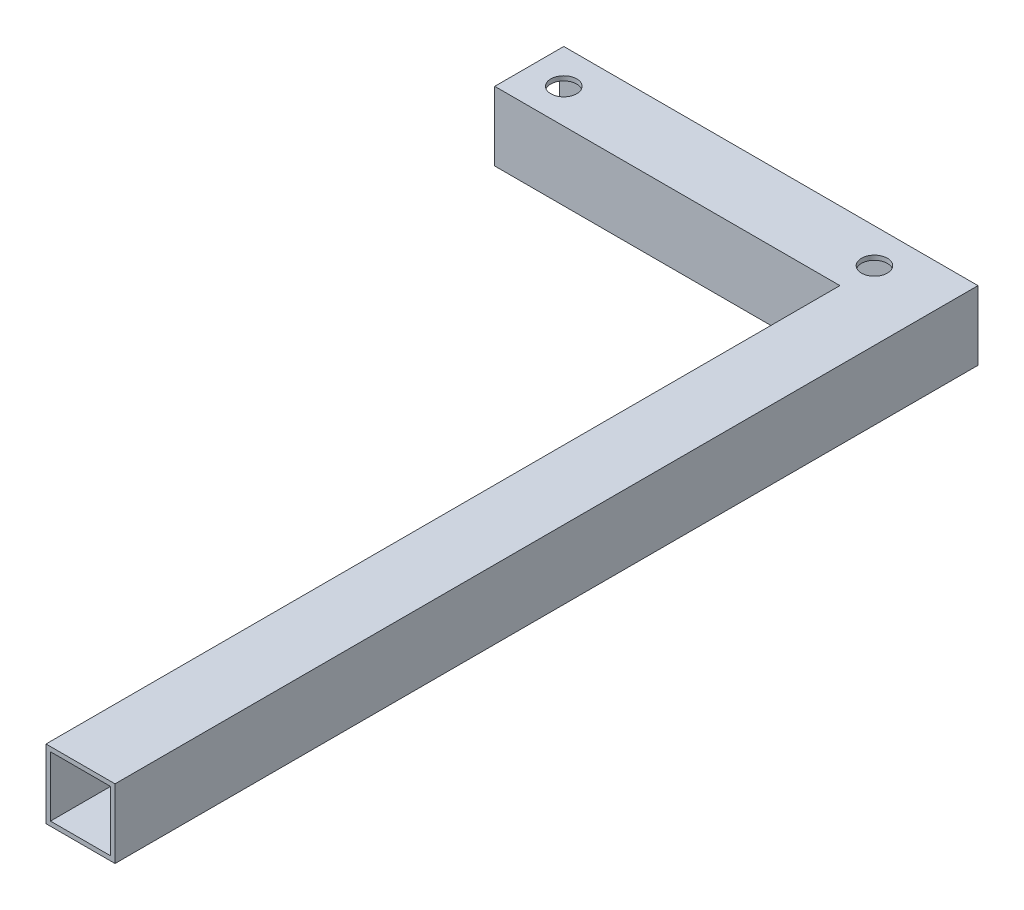
ISO-10303-21;
HEADER;
FILE_DESCRIPTION(('STEP AP214'),'2;1');
FILE_NAME('part.step','',(''),(''),'','','');
FILE_SCHEMA(('AUTOMOTIVE_DESIGN { 1 0 10303 214 1 1 1 1 }'));
ENDSEC;
DATA;
#1=APPLICATION_CONTEXT('core data for automotive mechanical design processes');
#2=APPLICATION_PROTOCOL_DEFINITION('international standard','automotive_design',2000,#1);
#3=PRODUCT_CONTEXT('',#1,'mechanical');
#4=PRODUCT('Part','Part','',(#3));
#5=PRODUCT_RELATED_PRODUCT_CATEGORY('part','',(#4));
#6=PRODUCT_DEFINITION_FORMATION('','',#4);
#7=PRODUCT_DEFINITION_CONTEXT('part definition',#1,'design');
#8=PRODUCT_DEFINITION('design','',#6,#7);
#9=PRODUCT_DEFINITION_SHAPE('','',#8);
#10=(LENGTH_UNIT() NAMED_UNIT(*) SI_UNIT(.MILLI.,.METRE.));
#11=(NAMED_UNIT(*) PLANE_ANGLE_UNIT() SI_UNIT($,.RADIAN.));
#12=(NAMED_UNIT(*) SI_UNIT($,.STERADIAN.) SOLID_ANGLE_UNIT());
#13=UNCERTAINTY_MEASURE_WITH_UNIT(LENGTH_MEASURE(1.E-05),#10,'distance_accuracy_value','');
#14=(GEOMETRIC_REPRESENTATION_CONTEXT(3) GLOBAL_UNCERTAINTY_ASSIGNED_CONTEXT((#13)) GLOBAL_UNIT_ASSIGNED_CONTEXT((#10,
#11,#12)) REPRESENTATION_CONTEXT('',''));
#15=CARTESIAN_POINT('',(0.,0.,0.));
#16=DIRECTION('',(0.,0.,1.));
#17=DIRECTION('',(1.,0.,0.));
#18=AXIS2_PLACEMENT_3D('',#15,#16,#17);
#19=CARTESIAN_POINT('',(-12.7,12.7,-12.7));
#20=DIRECTION('',(1.,0.,0.));
#21=DIRECTION('',(0.,0.,-1.));
#22=AXIS2_PLACEMENT_3D('',#19,#20,#21);
#23=PLANE('',#22);
#24=DIRECTION('',(0.,0.,1.));
#25=VECTOR('',#24,1.);
#26=CARTESIAN_POINT('',(-12.7,-12.7,-12.7));
#27=LINE('',#26,#25);
#28=CARTESIAN_POINT('',(-12.7,-12.7,-12.7));
#29=VERTEX_POINT('',#28);
#30=CARTESIAN_POINT('',(-12.7,-12.7,12.7));
#31=VERTEX_POINT('',#30);
#32=EDGE_CURVE('E194',#29,#31,#27,.T.);
#33=ORIENTED_EDGE('',*,*,#32,.T.);
#34=DIRECTION('',(0.,-1.,0.));
#35=VECTOR('',#34,1.);
#36=CARTESIAN_POINT('',(-12.7,12.7,12.7));
#37=LINE('',#36,#35);
#38=CARTESIAN_POINT('',(-12.7,12.7,12.7));
#39=VERTEX_POINT('',#38);
#40=EDGE_CURVE('E11',#39,#31,#37,.T.);
#41=ORIENTED_EDGE('',*,*,#40,.F.);
#42=DIRECTION('',(0.,0.,1.));
#43=VECTOR('',#42,1.);
#44=CARTESIAN_POINT('',(-12.7,12.7,-12.7));
#45=LINE('',#44,#43);
#46=CARTESIAN_POINT('',(-12.7,12.7,-12.7));
#47=VERTEX_POINT('',#46);
#48=EDGE_CURVE('E197',#47,#39,#45,.T.);
#49=ORIENTED_EDGE('',*,*,#48,.F.);
#50=DIRECTION('',(0.,-1.,0.));
#51=VECTOR('',#50,1.);
#52=CARTESIAN_POINT('',(-12.7,12.7,-12.7));
#53=LINE('',#52,#51);
#54=EDGE_CURVE('E211',#47,#29,#53,.T.);
#55=ORIENTED_EDGE('',*,*,#54,.T.);
#56=EDGE_LOOP('',(#33,#41,#49,#55));
#57=FACE_BOUND('',#56,.T.);
#58=DIRECTION('',(0.,0.,1.));
#59=VECTOR('',#58,1.);
#60=CARTESIAN_POINT('',(-12.7,-11.049,-12.7));
#61=LINE('',#60,#59);
#62=CARTESIAN_POINT('',(-12.7,-11.049,-11.049));
#63=VERTEX_POINT('',#62);
#64=CARTESIAN_POINT('',(-12.7,-11.049,11.049));
#65=VERTEX_POINT('',#64);
#66=EDGE_CURVE('E150',#63,#65,#61,.T.);
#67=ORIENTED_EDGE('',*,*,#66,.F.);
#68=DIRECTION('',(0.,-1.,0.));
#69=VECTOR('',#68,1.);
#70=CARTESIAN_POINT('',(-12.7,12.7,-11.049));
#71=LINE('',#70,#69);
#72=CARTESIAN_POINT('',(-12.7,11.049,-11.049));
#73=VERTEX_POINT('',#72);
#74=EDGE_CURVE('E148',#73,#63,#71,.T.);
#75=ORIENTED_EDGE('',*,*,#74,.F.);
#76=DIRECTION('',(0.,0.,1.));
#77=VECTOR('',#76,1.);
#78=CARTESIAN_POINT('',(-12.7,11.049,-12.7));
#79=LINE('',#78,#77);
#80=CARTESIAN_POINT('',(-12.7,11.049,11.049));
#81=VERTEX_POINT('',#80);
#82=EDGE_CURVE('E47',#73,#81,#79,.T.);
#83=ORIENTED_EDGE('',*,*,#82,.T.);
#84=DIRECTION('',(0.,-1.,0.));
#85=VECTOR('',#84,1.);
#86=CARTESIAN_POINT('',(-12.7,12.7,11.049));
#87=LINE('',#86,#85);
#88=EDGE_CURVE('E129',#81,#65,#87,.T.);
#89=ORIENTED_EDGE('',*,*,#88,.T.);
#90=EDGE_LOOP('',(#67,#75,#83,#89));
#91=FACE_BOUND('',#90,.T.);
#92=ADVANCED_FACE('F33',(#57,#91),#23,.F.);
#93=CARTESIAN_POINT('',(139.7,12.7,304.8));
#94=DIRECTION('',(0.,0.,-1.));
#95=DIRECTION('',(-1.,0.,0.));
#96=AXIS2_PLACEMENT_3D('',#93,#94,#95);
#97=PLANE('',#96);
#98=DIRECTION('',(1.,0.,0.));
#99=VECTOR('',#98,1.);
#100=CARTESIAN_POINT('',(139.7,-12.7,304.8));
#101=LINE('',#100,#99);
#102=CARTESIAN_POINT('',(114.3,-12.7,304.8));
#103=VERTEX_POINT('',#102);
#104=CARTESIAN_POINT('',(139.7,-12.7,304.8));
#105=VERTEX_POINT('',#104);
#106=EDGE_CURVE('E218',#103,#105,#101,.T.);
#107=ORIENTED_EDGE('',*,*,#106,.T.);
#108=DIRECTION('',(0.,-1.,0.));
#109=VECTOR('',#108,1.);
#110=CARTESIAN_POINT('',(139.7,12.7,304.8));
#111=LINE('',#110,#109);
#112=CARTESIAN_POINT('',(139.7,12.7,304.8));
#113=VERTEX_POINT('',#112);
#114=EDGE_CURVE('E228',#113,#105,#111,.T.);
#115=ORIENTED_EDGE('',*,*,#114,.F.);
#116=DIRECTION('',(1.,0.,0.));
#117=VECTOR('',#116,1.);
#118=CARTESIAN_POINT('',(139.7,12.7,304.8));
#119=LINE('',#118,#117);
#120=CARTESIAN_POINT('',(114.3,12.7,304.8));
#121=VERTEX_POINT('',#120);
#122=EDGE_CURVE('E205',#121,#113,#119,.T.);
#123=ORIENTED_EDGE('',*,*,#122,.F.);
#124=DIRECTION('',(0.,-1.,0.));
#125=VECTOR('',#124,1.);
#126=CARTESIAN_POINT('',(114.3,12.7,304.8));
#127=LINE('',#126,#125);
#128=EDGE_CURVE('E231',#121,#103,#127,.T.);
#129=ORIENTED_EDGE('',*,*,#128,.T.);
#130=EDGE_LOOP('',(#107,#115,#123,#129));
#131=FACE_BOUND('',#130,.T.);
#132=DIRECTION('',(1.,0.,0.));
#133=VECTOR('',#132,1.);
#134=CARTESIAN_POINT('',(139.7,-11.049,304.8));
#135=LINE('',#134,#133);
#136=CARTESIAN_POINT('',(115.951,-11.049,304.8));
#137=VERTEX_POINT('',#136);
#138=CARTESIAN_POINT('',(138.049,-11.049,304.8));
#139=VERTEX_POINT('',#138);
#140=EDGE_CURVE('E156',#137,#139,#135,.T.);
#141=ORIENTED_EDGE('',*,*,#140,.F.);
#142=DIRECTION('',(0.,-1.,0.));
#143=VECTOR('',#142,1.);
#144=CARTESIAN_POINT('',(115.951,12.7,304.8));
#145=LINE('',#144,#143);
#146=CARTESIAN_POINT('',(115.951,11.049,304.8));
#147=VERTEX_POINT('',#146);
#148=EDGE_CURVE('E137',#147,#137,#145,.T.);
#149=ORIENTED_EDGE('',*,*,#148,.F.);
#150=DIRECTION('',(1.,0.,0.));
#151=VECTOR('',#150,1.);
#152=CARTESIAN_POINT('',(139.7,11.049,304.8));
#153=LINE('',#152,#151);
#154=CARTESIAN_POINT('',(138.049,11.049,304.8));
#155=VERTEX_POINT('',#154);
#156=EDGE_CURVE('E54',#147,#155,#153,.T.);
#157=ORIENTED_EDGE('',*,*,#156,.T.);
#158=DIRECTION('',(0.,-1.,0.));
#159=VECTOR('',#158,1.);
#160=CARTESIAN_POINT('',(138.049,12.7,304.8));
#161=LINE('',#160,#159);
#162=EDGE_CURVE('E161',#155,#139,#161,.T.);
#163=ORIENTED_EDGE('',*,*,#162,.T.);
#164=EDGE_LOOP('',(#141,#149,#157,#163));
#165=FACE_BOUND('',#164,.T.);
#166=ADVANCED_FACE('F250',(#131,#165),#97,.F.);
#167=CARTESIAN_POINT('',(0.,12.7,0.));
#168=DIRECTION('',(0.,-1.,0.));
#169=DIRECTION('',(0.,0.,-1.));
#170=AXIS2_PLACEMENT_3D('',#167,#168,#169);
#171=CYLINDRICAL_SURFACE('',#170,4.7625);
#172=CARTESIAN_POINT('',(0.,-12.7,0.));
#173=DIRECTION('',(0.,1.,0.));
#174=DIRECTION('',(0.,0.,1.));
#175=AXIS2_PLACEMENT_3D('',#172,#173,#174);
#176=CIRCLE('',#175,4.7625);
#177=CARTESIAN_POINT('',(0.,-12.7,4.7625));
#178=VERTEX_POINT('',#177);
#179=EDGE_CURVE('E188',#178,#178,#176,.T.);
#180=ORIENTED_EDGE('',*,*,#179,.F.);
#181=EDGE_LOOP('',(#180));
#182=FACE_BOUND('',#181,.T.);
#183=CARTESIAN_POINT('',(0.,-11.049,0.));
#184=DIRECTION('',(0.,1.,0.));
#185=DIRECTION('',(0.,0.,1.));
#186=AXIS2_PLACEMENT_3D('',#183,#184,#185);
#187=CIRCLE('',#186,4.7625);
#188=CARTESIAN_POINT('',(0.,-11.049,4.7625));
#189=VERTEX_POINT('',#188);
#190=EDGE_CURVE('E165',#189,#189,#187,.T.);
#191=ORIENTED_EDGE('',*,*,#190,.T.);
#192=EDGE_LOOP('',(#191));
#193=FACE_BOUND('',#192,.T.);
#194=ADVANCED_FACE('F279',(#182,#193),#171,.F.);
#195=CARTESIAN_POINT('',(114.3,12.7,0.));
#196=DIRECTION('',(0.,-1.,0.));
#197=DIRECTION('',(0.,0.,-1.));
#198=AXIS2_PLACEMENT_3D('',#195,#196,#197);
#199=CYLINDRICAL_SURFACE('',#198,4.76250000000001);
#200=CARTESIAN_POINT('',(114.3,-12.7,0.));
#201=DIRECTION('',(0.,1.,0.));
#202=DIRECTION('',(0.,0.,1.));
#203=AXIS2_PLACEMENT_3D('',#200,#201,#202);
#204=CIRCLE('',#203,4.76250000000001);
#205=CARTESIAN_POINT('',(114.3,-12.7,4.76250000000001));
#206=VERTEX_POINT('',#205);
#207=EDGE_CURVE('E171',#206,#206,#204,.T.);
#208=ORIENTED_EDGE('',*,*,#207,.F.);
#209=EDGE_LOOP('',(#208));
#210=FACE_BOUND('',#209,.T.);
#211=CARTESIAN_POINT('',(114.3,-11.049,0.));
#212=DIRECTION('',(0.,1.,0.));
#213=DIRECTION('',(0.,0.,1.));
#214=AXIS2_PLACEMENT_3D('',#211,#212,#213);
#215=CIRCLE('',#214,4.76250000000001);
#216=CARTESIAN_POINT('',(114.3,-11.049,4.76250000000001));
#217=VERTEX_POINT('',#216);
#218=EDGE_CURVE('E180',#217,#217,#215,.T.);
#219=ORIENTED_EDGE('',*,*,#218,.T.);
#220=EDGE_LOOP('',(#219));
#221=FACE_BOUND('',#220,.T.);
#222=ADVANCED_FACE('F290',(#210,#221),#199,.F.);
#223=CARTESIAN_POINT('',(0.,12.7,0.));
#224=DIRECTION('',(0.,1.,0.));
#225=DIRECTION('',(0.,0.,1.));
#226=AXIS2_PLACEMENT_3D('',#223,#224,#225);
#227=PLANE('',#226);
#228=CARTESIAN_POINT('',(0.,12.7,0.));
#229=DIRECTION('',(0.,1.,0.));
#230=DIRECTION('',(0.,0.,1.));
#231=AXIS2_PLACEMENT_3D('',#228,#229,#230);
#232=CIRCLE('',#231,4.7625);
#233=CARTESIAN_POINT('',(0.,12.7,4.7625));
#234=VERTEX_POINT('',#233);
#235=EDGE_CURVE('E191',#234,#234,#232,.T.);
#236=ORIENTED_EDGE('',*,*,#235,.F.);
#237=EDGE_LOOP('',(#236));
#238=FACE_BOUND('',#237,.T.);
#239=ORIENTED_EDGE('',*,*,#48,.T.);
#240=DIRECTION('',(1.,0.,0.));
#241=VECTOR('',#240,1.);
#242=CARTESIAN_POINT('',(-12.7,12.7,12.7));
#243=LINE('',#242,#241);
#244=CARTESIAN_POINT('',(114.3,12.7,12.7));
#245=VERTEX_POINT('',#244);
#246=EDGE_CURVE('E200',#39,#245,#243,.T.);
#247=ORIENTED_EDGE('',*,*,#246,.T.);
#248=DIRECTION('',(0.,0.,1.));
#249=VECTOR('',#248,1.);
#250=CARTESIAN_POINT('',(114.3,12.7,12.7));
#251=LINE('',#250,#249);
#252=EDGE_CURVE('E203',#245,#121,#251,.T.);
#253=ORIENTED_EDGE('',*,*,#252,.T.);
#254=ORIENTED_EDGE('',*,*,#122,.T.);
#255=DIRECTION('',(0.,0.,-1.));
#256=VECTOR('',#255,1.);
#257=CARTESIAN_POINT('',(139.7,12.7,-12.7));
#258=LINE('',#257,#256);
#259=CARTESIAN_POINT('',(139.7,12.7,-12.7));
#260=VERTEX_POINT('',#259);
#261=EDGE_CURVE('E207',#113,#260,#258,.T.);
#262=ORIENTED_EDGE('',*,*,#261,.T.);
#263=DIRECTION('',(-1.,0.,0.));
#264=VECTOR('',#263,1.);
#265=CARTESIAN_POINT('',(-12.7,12.7,-12.7));
#266=LINE('',#265,#264);
#267=EDGE_CURVE('E209',#260,#47,#266,.T.);
#268=ORIENTED_EDGE('',*,*,#267,.T.);
#269=EDGE_LOOP('',(#239,#247,#253,#254,#262,#268));
#270=FACE_BOUND('',#269,.T.);
#271=CARTESIAN_POINT('',(114.3,12.7,0.));
#272=DIRECTION('',(0.,1.,0.));
#273=DIRECTION('',(0.,0.,1.));
#274=AXIS2_PLACEMENT_3D('',#271,#272,#273);
#275=CIRCLE('',#274,4.76250000000001);
#276=CARTESIAN_POINT('',(114.3,12.7,4.76250000000001));
#277=VERTEX_POINT('',#276);
#278=EDGE_CURVE('E185',#277,#277,#275,.T.);
#279=ORIENTED_EDGE('',*,*,#278,.F.);
#280=EDGE_LOOP('',(#279));
#281=FACE_BOUND('',#280,.T.);
#282=ADVANCED_FACE('F259',(#238,#270,#281),#227,.T.);
#283=CARTESIAN_POINT('',(0.,-12.7,0.));
#284=DIRECTION('',(0.,1.,0.));
#285=DIRECTION('',(0.,0.,1.));
#286=AXIS2_PLACEMENT_3D('',#283,#284,#285);
#287=PLANE('',#286);
#288=ORIENTED_EDGE('',*,*,#32,.F.);
#289=DIRECTION('',(-1.,0.,0.));
#290=VECTOR('',#289,1.);
#291=CARTESIAN_POINT('',(-12.7,-12.7,-12.7));
#292=LINE('',#291,#290);
#293=CARTESIAN_POINT('',(139.7,-12.7,-12.7));
#294=VERTEX_POINT('',#293);
#295=EDGE_CURVE('E201',#294,#29,#292,.T.);
#296=ORIENTED_EDGE('',*,*,#295,.F.);
#297=DIRECTION('',(0.,0.,-1.));
#298=VECTOR('',#297,1.);
#299=CARTESIAN_POINT('',(139.7,-12.7,-12.7));
#300=LINE('',#299,#298);
#301=EDGE_CURVE('E220',#105,#294,#300,.T.);
#302=ORIENTED_EDGE('',*,*,#301,.F.);
#303=ORIENTED_EDGE('',*,*,#106,.F.);
#304=DIRECTION('',(0.,0.,1.));
#305=VECTOR('',#304,1.);
#306=CARTESIAN_POINT('',(114.3,-12.7,12.7));
#307=LINE('',#306,#305);
#308=CARTESIAN_POINT('',(114.3,-12.7,12.7));
#309=VERTEX_POINT('',#308);
#310=EDGE_CURVE('E216',#309,#103,#307,.T.);
#311=ORIENTED_EDGE('',*,*,#310,.F.);
#312=DIRECTION('',(1.,0.,0.));
#313=VECTOR('',#312,1.);
#314=CARTESIAN_POINT('',(-12.7,-12.7,12.7));
#315=LINE('',#314,#313);
#316=EDGE_CURVE('E214',#31,#309,#315,.T.);
#317=ORIENTED_EDGE('',*,*,#316,.F.);
#318=EDGE_LOOP('',(#288,#296,#302,#303,#311,#317));
#319=FACE_BOUND('',#318,.T.);
#320=ORIENTED_EDGE('',*,*,#179,.T.);
#321=EDGE_LOOP('',(#320));
#322=FACE_BOUND('',#321,.T.);
#323=ORIENTED_EDGE('',*,*,#207,.T.);
#324=EDGE_LOOP('',(#323));
#325=FACE_BOUND('',#324,.T.);
#326=ADVANCED_FACE('F244',(#319,#322,#325),#287,.F.);
#327=CARTESIAN_POINT('',(-12.7,12.7,12.7));
#328=DIRECTION('',(0.,0.,-1.));
#329=DIRECTION('',(-1.,0.,0.));
#330=AXIS2_PLACEMENT_3D('',#327,#328,#329);
#331=PLANE('',#330);
#332=ORIENTED_EDGE('',*,*,#316,.T.);
#333=DIRECTION('',(0.,-1.,0.));
#334=VECTOR('',#333,1.);
#335=CARTESIAN_POINT('',(114.3,12.7,12.7));
#336=LINE('',#335,#334);
#337=EDGE_CURVE('E40',#245,#309,#336,.T.);
#338=ORIENTED_EDGE('',*,*,#337,.F.);
#339=ORIENTED_EDGE('',*,*,#246,.F.);
#340=ORIENTED_EDGE('',*,*,#40,.T.);
#341=EDGE_LOOP('',(#332,#338,#339,#340));
#342=FACE_BOUND('',#341,.T.);
#343=ADVANCED_FACE('F264',(#342),#331,.F.);
#344=CARTESIAN_POINT('',(114.3,12.7,12.7));
#345=DIRECTION('',(1.,0.,0.));
#346=DIRECTION('',(0.,0.,-1.));
#347=AXIS2_PLACEMENT_3D('',#344,#345,#346);
#348=PLANE('',#347);
#349=ORIENTED_EDGE('',*,*,#310,.T.);
#350=ORIENTED_EDGE('',*,*,#128,.F.);
#351=ORIENTED_EDGE('',*,*,#252,.F.);
#352=ORIENTED_EDGE('',*,*,#337,.T.);
#353=EDGE_LOOP('',(#349,#350,#351,#352));
#354=FACE_BOUND('',#353,.T.);
#355=ADVANCED_FACE('F238',(#354),#348,.F.);
#356=CARTESIAN_POINT('',(139.7,12.7,-12.7));
#357=DIRECTION('',(-1.,0.,0.));
#358=DIRECTION('',(0.,0.,1.));
#359=AXIS2_PLACEMENT_3D('',#356,#357,#358);
#360=PLANE('',#359);
#361=ORIENTED_EDGE('',*,*,#301,.T.);
#362=DIRECTION('',(0.,-1.,0.));
#363=VECTOR('',#362,1.);
#364=CARTESIAN_POINT('',(139.7,12.7,-12.7));
#365=LINE('',#364,#363);
#366=EDGE_CURVE('E225',#260,#294,#365,.T.);
#367=ORIENTED_EDGE('',*,*,#366,.F.);
#368=ORIENTED_EDGE('',*,*,#261,.F.);
#369=ORIENTED_EDGE('',*,*,#114,.T.);
#370=EDGE_LOOP('',(#361,#367,#368,#369));
#371=FACE_BOUND('',#370,.T.);
#372=ADVANCED_FACE('F255',(#371),#360,.F.);
#373=CARTESIAN_POINT('',(-12.7,12.7,-12.7));
#374=DIRECTION('',(0.,0.,1.));
#375=DIRECTION('',(1.,0.,0.));
#376=AXIS2_PLACEMENT_3D('',#373,#374,#375);
#377=PLANE('',#376);
#378=ORIENTED_EDGE('',*,*,#295,.T.);
#379=ORIENTED_EDGE('',*,*,#54,.F.);
#380=ORIENTED_EDGE('',*,*,#267,.F.);
#381=ORIENTED_EDGE('',*,*,#366,.T.);
#382=EDGE_LOOP('',(#378,#379,#380,#381));
#383=FACE_BOUND('',#382,.T.);
#384=ADVANCED_FACE('F268',(#383),#377,.F.);
#385=CARTESIAN_POINT('',(0.,11.049,0.));
#386=DIRECTION('',(0.,1.,0.));
#387=DIRECTION('',(0.,0.,1.));
#388=AXIS2_PLACEMENT_3D('',#385,#386,#387);
#389=CIRCLE('',#388,4.7625);
#390=CARTESIAN_POINT('',(0.,11.049,4.7625));
#391=VERTEX_POINT('',#390);
#392=EDGE_CURVE('E162',#391,#391,#389,.T.);
#393=ORIENTED_EDGE('',*,*,#392,.F.);
#394=EDGE_LOOP('',(#393));
#395=FACE_BOUND('',#394,.T.);
#396=ORIENTED_EDGE('',*,*,#235,.T.);
#397=EDGE_LOOP('',(#396));
#398=FACE_BOUND('',#397,.T.);
#399=ADVANCED_FACE('F270',(#395,#398),#171,.F.);
#400=CARTESIAN_POINT('',(114.3,11.049,0.));
#401=DIRECTION('',(0.,1.,0.));
#402=DIRECTION('',(0.,0.,1.));
#403=AXIS2_PLACEMENT_3D('',#400,#401,#402);
#404=CIRCLE('',#403,4.76250000000001);
#405=CARTESIAN_POINT('',(114.3,11.049,4.76250000000001));
#406=VERTEX_POINT('',#405);
#407=EDGE_CURVE('E177',#406,#406,#404,.T.);
#408=ORIENTED_EDGE('',*,*,#407,.F.);
#409=EDGE_LOOP('',(#408));
#410=FACE_BOUND('',#409,.T.);
#411=ORIENTED_EDGE('',*,*,#278,.T.);
#412=EDGE_LOOP('',(#411));
#413=FACE_BOUND('',#412,.T.);
#414=ADVANCED_FACE('F276',(#410,#413),#199,.F.);
#415=CARTESIAN_POINT('',(0.,11.049,0.));
#416=DIRECTION('',(0.,1.,0.));
#417=DIRECTION('',(0.,0.,1.));
#418=AXIS2_PLACEMENT_3D('',#415,#416,#417);
#419=PLANE('',#418);
#420=ORIENTED_EDGE('',*,*,#392,.T.);
#421=EDGE_LOOP('',(#420));
#422=FACE_BOUND('',#421,.T.);
#423=ORIENTED_EDGE('',*,*,#82,.F.);
#424=DIRECTION('',(-1.,0.,0.));
#425=VECTOR('',#424,1.);
#426=CARTESIAN_POINT('',(-12.7,11.049,-11.049));
#427=LINE('',#426,#425);
#428=CARTESIAN_POINT('',(138.049,11.049,-11.049));
#429=VERTEX_POINT('',#428);
#430=EDGE_CURVE('E146',#429,#73,#427,.T.);
#431=ORIENTED_EDGE('',*,*,#430,.F.);
#432=DIRECTION('',(0.,0.,-1.));
#433=VECTOR('',#432,1.);
#434=CARTESIAN_POINT('',(138.049,11.049,-12.7));
#435=LINE('',#434,#433);
#436=EDGE_CURVE('E142',#155,#429,#435,.T.);
#437=ORIENTED_EDGE('',*,*,#436,.F.);
#438=ORIENTED_EDGE('',*,*,#156,.F.);
#439=DIRECTION('',(0.,0.,1.));
#440=VECTOR('',#439,1.);
#441=CARTESIAN_POINT('',(115.951,11.049,12.7));
#442=LINE('',#441,#440);
#443=CARTESIAN_POINT('',(115.951,11.049,11.049));
#444=VERTEX_POINT('',#443);
#445=EDGE_CURVE('E130',#444,#147,#442,.T.);
#446=ORIENTED_EDGE('',*,*,#445,.F.);
#447=DIRECTION('',(1.,0.,0.));
#448=VECTOR('',#447,1.);
#449=CARTESIAN_POINT('',(-12.7,11.049,11.049));
#450=LINE('',#449,#448);
#451=EDGE_CURVE('E123',#81,#444,#450,.T.);
#452=ORIENTED_EDGE('',*,*,#451,.F.);
#453=EDGE_LOOP('',(#423,#431,#437,#438,#446,#452));
#454=FACE_BOUND('',#453,.T.);
#455=ORIENTED_EDGE('',*,*,#407,.T.);
#456=EDGE_LOOP('',(#455));
#457=FACE_BOUND('',#456,.T.);
#458=ADVANCED_FACE('F139',(#422,#454,#457),#419,.F.);
#459=CARTESIAN_POINT('',(0.,-11.049,0.));
#460=DIRECTION('',(0.,1.,0.));
#461=DIRECTION('',(0.,0.,1.));
#462=AXIS2_PLACEMENT_3D('',#459,#460,#461);
#463=PLANE('',#462);
#464=ORIENTED_EDGE('',*,*,#66,.T.);
#465=DIRECTION('',(1.,0.,0.));
#466=VECTOR('',#465,1.);
#467=CARTESIAN_POINT('',(-12.7,-11.049,11.049));
#468=LINE('',#467,#466);
#469=CARTESIAN_POINT('',(115.951,-11.049,11.049));
#470=VERTEX_POINT('',#469);
#471=EDGE_CURVE('E149',#65,#470,#468,.T.);
#472=ORIENTED_EDGE('',*,*,#471,.T.);
#473=DIRECTION('',(0.,0.,1.));
#474=VECTOR('',#473,1.);
#475=CARTESIAN_POINT('',(115.951,-11.049,12.7));
#476=LINE('',#475,#474);
#477=EDGE_CURVE('E136',#470,#137,#476,.T.);
#478=ORIENTED_EDGE('',*,*,#477,.T.);
#479=ORIENTED_EDGE('',*,*,#140,.T.);
#480=DIRECTION('',(0.,0.,-1.));
#481=VECTOR('',#480,1.);
#482=CARTESIAN_POINT('',(138.049,-11.049,-12.7));
#483=LINE('',#482,#481);
#484=CARTESIAN_POINT('',(138.049,-11.049,-11.049));
#485=VERTEX_POINT('',#484);
#486=EDGE_CURVE('E154',#139,#485,#483,.T.);
#487=ORIENTED_EDGE('',*,*,#486,.T.);
#488=DIRECTION('',(-1.,0.,0.));
#489=VECTOR('',#488,1.);
#490=CARTESIAN_POINT('',(-12.7,-11.049,-11.049));
#491=LINE('',#490,#489);
#492=EDGE_CURVE('E152',#485,#63,#491,.T.);
#493=ORIENTED_EDGE('',*,*,#492,.T.);
#494=EDGE_LOOP('',(#464,#472,#478,#479,#487,#493));
#495=FACE_BOUND('',#494,.T.);
#496=ORIENTED_EDGE('',*,*,#190,.F.);
#497=EDGE_LOOP('',(#496));
#498=FACE_BOUND('',#497,.T.);
#499=ORIENTED_EDGE('',*,*,#218,.F.);
#500=EDGE_LOOP('',(#499));
#501=FACE_BOUND('',#500,.T.);
#502=ADVANCED_FACE('F319',(#495,#498,#501),#463,.T.);
#503=CARTESIAN_POINT('',(-12.7,12.7,11.049));
#504=DIRECTION('',(0.,0.,-1.));
#505=DIRECTION('',(-1.,0.,0.));
#506=AXIS2_PLACEMENT_3D('',#503,#504,#505);
#507=PLANE('',#506);
#508=ORIENTED_EDGE('',*,*,#471,.F.);
#509=ORIENTED_EDGE('',*,*,#88,.F.);
#510=ORIENTED_EDGE('',*,*,#451,.T.);
#511=DIRECTION('',(0.,-1.,0.));
#512=VECTOR('',#511,1.);
#513=CARTESIAN_POINT('',(115.951,12.7,11.049));
#514=LINE('',#513,#512);
#515=EDGE_CURVE('E126',#444,#470,#514,.T.);
#516=ORIENTED_EDGE('',*,*,#515,.T.);
#517=EDGE_LOOP('',(#508,#509,#510,#516));
#518=FACE_BOUND('',#517,.T.);
#519=ADVANCED_FACE('F125',(#518),#507,.T.);
#520=CARTESIAN_POINT('',(115.951,12.7,12.7));
#521=DIRECTION('',(1.,0.,0.));
#522=DIRECTION('',(0.,0.,-1.));
#523=AXIS2_PLACEMENT_3D('',#520,#521,#522);
#524=PLANE('',#523);
#525=ORIENTED_EDGE('',*,*,#477,.F.);
#526=ORIENTED_EDGE('',*,*,#515,.F.);
#527=ORIENTED_EDGE('',*,*,#445,.T.);
#528=ORIENTED_EDGE('',*,*,#148,.T.);
#529=EDGE_LOOP('',(#525,#526,#527,#528));
#530=FACE_BOUND('',#529,.T.);
#531=ADVANCED_FACE('F133',(#530),#524,.T.);
#532=CARTESIAN_POINT('',(138.049,12.7,-12.7));
#533=DIRECTION('',(-1.,0.,0.));
#534=DIRECTION('',(0.,0.,1.));
#535=AXIS2_PLACEMENT_3D('',#532,#533,#534);
#536=PLANE('',#535);
#537=ORIENTED_EDGE('',*,*,#486,.F.);
#538=ORIENTED_EDGE('',*,*,#162,.F.);
#539=ORIENTED_EDGE('',*,*,#436,.T.);
#540=DIRECTION('',(0.,-1.,0.));
#541=VECTOR('',#540,1.);
#542=CARTESIAN_POINT('',(138.049,12.7,-11.049));
#543=LINE('',#542,#541);
#544=EDGE_CURVE('E158',#429,#485,#543,.T.);
#545=ORIENTED_EDGE('',*,*,#544,.T.);
#546=EDGE_LOOP('',(#537,#538,#539,#545));
#547=FACE_BOUND('',#546,.T.);
#548=ADVANCED_FACE('F310',(#547),#536,.T.);
#549=CARTESIAN_POINT('',(-12.7,12.7,-11.049));
#550=DIRECTION('',(0.,0.,1.));
#551=DIRECTION('',(1.,0.,0.));
#552=AXIS2_PLACEMENT_3D('',#549,#550,#551);
#553=PLANE('',#552);
#554=ORIENTED_EDGE('',*,*,#492,.F.);
#555=ORIENTED_EDGE('',*,*,#544,.F.);
#556=ORIENTED_EDGE('',*,*,#430,.T.);
#557=ORIENTED_EDGE('',*,*,#74,.T.);
#558=EDGE_LOOP('',(#554,#555,#556,#557));
#559=FACE_BOUND('',#558,.T.);
#560=ADVANCED_FACE('F307',(#559),#553,.T.);
#561=CLOSED_SHELL('',(#92,#166,#194,#222,#282,#326,#343,#355,#372,#384,#399,#414,#458,#502,#519,
#531,#548,#560));
#562=MANIFOLD_SOLID_BREP('B2',#561);
#563=ADVANCED_BREP_SHAPE_REPRESENTATION('',(#18,#562),#14);
#564=SHAPE_DEFINITION_REPRESENTATION(#9,#563);
ENDSEC;
END-ISO-10303-21;
